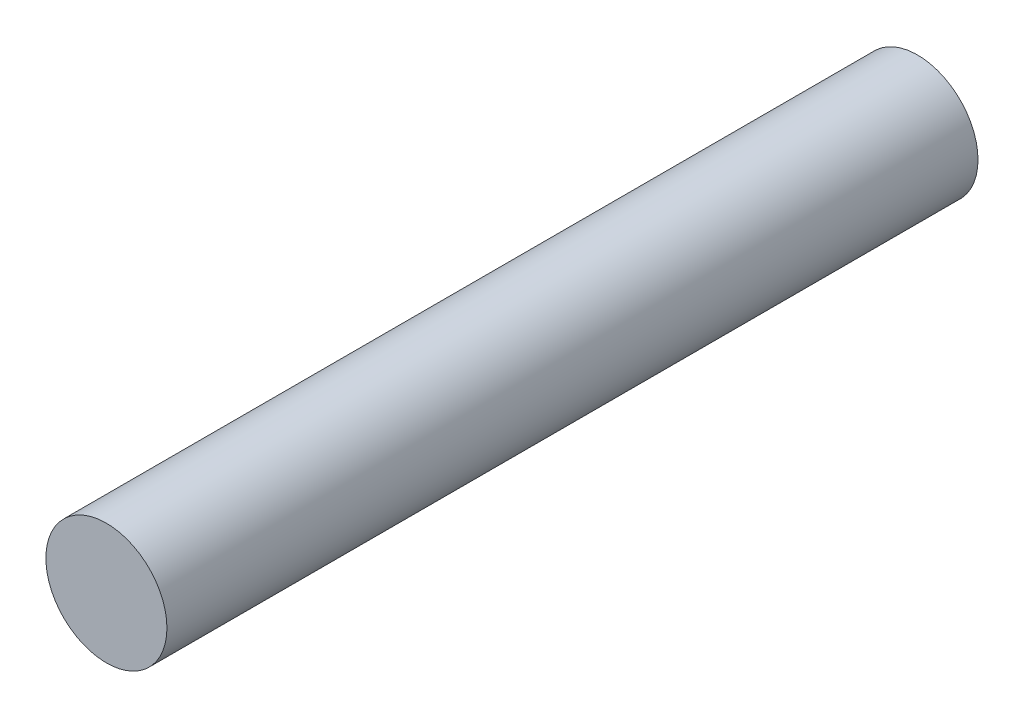
ISO-10303-21;
HEADER;
FILE_DESCRIPTION(('STEP AP214'),'2;1');
FILE_NAME('part.step','',(''),(''),'','','');
FILE_SCHEMA(('AUTOMOTIVE_DESIGN { 1 0 10303 214 1 1 1 1 }'));
ENDSEC;
DATA;
#1=APPLICATION_CONTEXT('core data for automotive mechanical design processes');
#2=APPLICATION_PROTOCOL_DEFINITION('international standard','automotive_design',2000,#1);
#3=PRODUCT_CONTEXT('',#1,'mechanical');
#4=PRODUCT('Part','Part','',(#3));
#5=PRODUCT_RELATED_PRODUCT_CATEGORY('part','',(#4));
#6=PRODUCT_DEFINITION_FORMATION('','',#4);
#7=PRODUCT_DEFINITION_CONTEXT('part definition',#1,'design');
#8=PRODUCT_DEFINITION('design','',#6,#7);
#9=PRODUCT_DEFINITION_SHAPE('','',#8);
#10=(LENGTH_UNIT() NAMED_UNIT(*) SI_UNIT(.MILLI.,.METRE.));
#11=(NAMED_UNIT(*) PLANE_ANGLE_UNIT() SI_UNIT($,.RADIAN.));
#12=(NAMED_UNIT(*) SI_UNIT($,.STERADIAN.) SOLID_ANGLE_UNIT());
#13=UNCERTAINTY_MEASURE_WITH_UNIT(LENGTH_MEASURE(1.E-05),#10,'distance_accuracy_value','');
#14=(GEOMETRIC_REPRESENTATION_CONTEXT(3) GLOBAL_UNCERTAINTY_ASSIGNED_CONTEXT((#13)) GLOBAL_UNIT_ASSIGNED_CONTEXT((#10,
#11,#12)) REPRESENTATION_CONTEXT('',''));
#15=CARTESIAN_POINT('',(0.,0.,0.));
#16=DIRECTION('',(0.,0.,1.));
#17=DIRECTION('',(1.,0.,0.));
#18=AXIS2_PLACEMENT_3D('',#15,#16,#17);
#19=CARTESIAN_POINT('',(0.,0.,67.));
#20=DIRECTION('',(0.,0.,-1.));
#21=DIRECTION('',(-1.,0.,0.));
#22=AXIS2_PLACEMENT_3D('',#19,#20,#21);
#23=CYLINDRICAL_SURFACE('',#22,5.);
#24=CARTESIAN_POINT('',(0.,0.,67.));
#25=DIRECTION('',(0.,0.,1.));
#26=DIRECTION('',(1.,0.,0.));
#27=AXIS2_PLACEMENT_3D('',#24,#25,#26);
#28=CIRCLE('',#27,5.);
#29=CARTESIAN_POINT('',(5.,0.,67.));
#30=VERTEX_POINT('',#29);
#31=EDGE_CURVE('E10',#30,#30,#28,.T.);
#32=ORIENTED_EDGE('',*,*,#31,.F.);
#33=EDGE_LOOP('',(#32));
#34=FACE_BOUND('',#33,.T.);
#35=CARTESIAN_POINT('',(0.,0.,0.));
#36=DIRECTION('',(0.,0.,1.));
#37=DIRECTION('',(1.,0.,0.));
#38=AXIS2_PLACEMENT_3D('',#35,#36,#37);
#39=CIRCLE('',#38,5.);
#40=CARTESIAN_POINT('',(5.,0.,0.));
#41=VERTEX_POINT('',#40);
#42=EDGE_CURVE('E35',#41,#41,#39,.T.);
#43=ORIENTED_EDGE('',*,*,#42,.T.);
#44=EDGE_LOOP('',(#43));
#45=FACE_BOUND('',#44,.T.);
#46=ADVANCED_FACE('F32',(#34,#45),#23,.T.);
#47=CARTESIAN_POINT('',(0.,0.,67.));
#48=DIRECTION('',(0.,0.,1.));
#49=DIRECTION('',(1.,0.,0.));
#50=AXIS2_PLACEMENT_3D('',#47,#48,#49);
#51=PLANE('',#50);
#52=ORIENTED_EDGE('',*,*,#31,.T.);
#53=EDGE_LOOP('',(#52));
#54=FACE_BOUND('',#53,.T.);
#55=ADVANCED_FACE('F47',(#54),#51,.T.);
#56=CARTESIAN_POINT('',(0.,0.,0.));
#57=DIRECTION('',(0.,0.,1.));
#58=DIRECTION('',(1.,0.,0.));
#59=AXIS2_PLACEMENT_3D('',#56,#57,#58);
#60=PLANE('',#59);
#61=ORIENTED_EDGE('',*,*,#42,.F.);
#62=EDGE_LOOP('',(#61));
#63=FACE_BOUND('',#62,.T.);
#64=ADVANCED_FACE('F45',(#63),#60,.F.);
#65=CLOSED_SHELL('',(#46,#55,#64));
#66=MANIFOLD_SOLID_BREP('B2',#65);
#67=ADVANCED_BREP_SHAPE_REPRESENTATION('',(#18,#66),#14);
#68=SHAPE_DEFINITION_REPRESENTATION(#9,#67);
ENDSEC;
END-ISO-10303-21;
